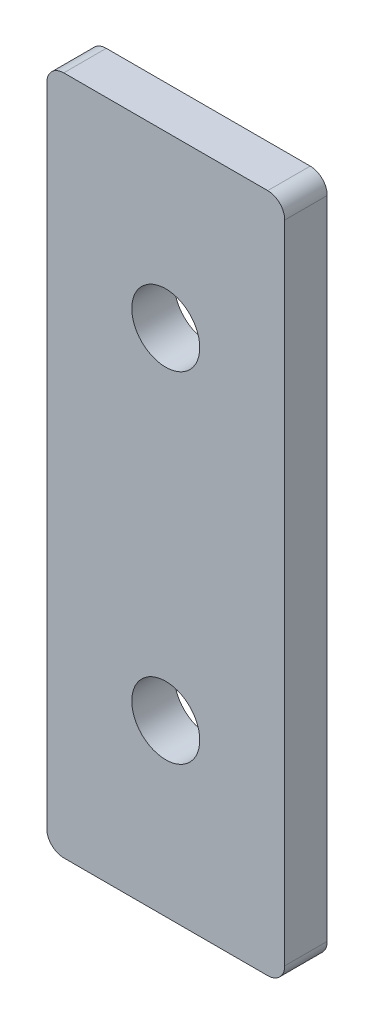
ISO-10303-21;
HEADER;
FILE_DESCRIPTION(('STEP AP214'),'2;1');
FILE_NAME('part.step','',(''),(''),'','','');
FILE_SCHEMA(('AUTOMOTIVE_DESIGN { 1 0 10303 214 1 1 1 1 }'));
ENDSEC;
DATA;
#1=APPLICATION_CONTEXT('core data for automotive mechanical design processes');
#2=APPLICATION_PROTOCOL_DEFINITION('international standard','automotive_design',2000,#1);
#3=PRODUCT_CONTEXT('',#1,'mechanical');
#4=PRODUCT('Part','Part','',(#3));
#5=PRODUCT_RELATED_PRODUCT_CATEGORY('part','',(#4));
#6=PRODUCT_DEFINITION_FORMATION('','',#4);
#7=PRODUCT_DEFINITION_CONTEXT('part definition',#1,'design');
#8=PRODUCT_DEFINITION('design','',#6,#7);
#9=PRODUCT_DEFINITION_SHAPE('','',#8);
#10=(LENGTH_UNIT() NAMED_UNIT(*) SI_UNIT(.MILLI.,.METRE.));
#11=(NAMED_UNIT(*) PLANE_ANGLE_UNIT() SI_UNIT($,.RADIAN.));
#12=(NAMED_UNIT(*) SI_UNIT($,.STERADIAN.) SOLID_ANGLE_UNIT());
#13=UNCERTAINTY_MEASURE_WITH_UNIT(LENGTH_MEASURE(1.E-05),#10,'distance_accuracy_value','');
#14=(GEOMETRIC_REPRESENTATION_CONTEXT(3) GLOBAL_UNCERTAINTY_ASSIGNED_CONTEXT((#13)) GLOBAL_UNIT_ASSIGNED_CONTEXT((#10,
#11,#12)) REPRESENTATION_CONTEXT('',''));
#15=CARTESIAN_POINT('',(0.,0.,0.));
#16=DIRECTION('',(0.,0.,1.));
#17=DIRECTION('',(1.,0.,0.));
#18=AXIS2_PLACEMENT_3D('',#15,#16,#17);
#19=CARTESIAN_POINT('',(0.,0.,2.5));
#20=DIRECTION('',(0.,0.,-1.));
#21=DIRECTION('',(-1.,0.,0.));
#22=AXIS2_PLACEMENT_3D('',#19,#20,#21);
#23=PLANE('',#22);
#24=DIRECTION('',(1.,0.,0.));
#25=VECTOR('',#24,1.);
#26=CARTESIAN_POINT('',(0.,0.,2.5));
#27=LINE('',#26,#25);
#28=CARTESIAN_POINT('',(1.,0.,2.5));
#29=VERTEX_POINT('',#28);
#30=CARTESIAN_POINT('',(13.,0.,2.5));
#31=VERTEX_POINT('',#30);
#32=EDGE_CURVE('E169',#29,#31,#27,.T.);
#33=ORIENTED_EDGE('',*,*,#32,.T.);
#34=CARTESIAN_POINT('',(13.,1.,2.5));
#35=DIRECTION('',(0.,0.,-1.));
#36=DIRECTION('',(-1.,0.,0.));
#37=AXIS2_PLACEMENT_3D('',#34,#35,#36);
#38=CIRCLE('',#37,1.);
#39=CARTESIAN_POINT('',(14.,1.,2.5));
#40=VERTEX_POINT('',#39);
#41=EDGE_CURVE('E147',#31,#40,#38,.F.);
#42=ORIENTED_EDGE('',*,*,#41,.T.);
#43=DIRECTION('',(0.,1.,0.));
#44=VECTOR('',#43,1.);
#45=CARTESIAN_POINT('',(14.,0.,2.5));
#46=LINE('',#45,#44);
#47=CARTESIAN_POINT('',(14.,39.,2.5));
#48=VERTEX_POINT('',#47);
#49=EDGE_CURVE('E117',#40,#48,#46,.T.);
#50=ORIENTED_EDGE('',*,*,#49,.T.);
#51=CARTESIAN_POINT('',(13.,39.,2.5));
#52=DIRECTION('',(0.,0.,-1.));
#53=DIRECTION('',(-1.,0.,0.));
#54=AXIS2_PLACEMENT_3D('',#51,#52,#53);
#55=CIRCLE('',#54,1.);
#56=CARTESIAN_POINT('',(13.,40.,2.5));
#57=VERTEX_POINT('',#56);
#58=EDGE_CURVE('E53',#48,#57,#55,.F.);
#59=ORIENTED_EDGE('',*,*,#58,.T.);
#60=DIRECTION('',(-1.,0.,0.));
#61=VECTOR('',#60,1.);
#62=CARTESIAN_POINT('',(0.,40.,2.5));
#63=LINE('',#62,#61);
#64=CARTESIAN_POINT('',(1.,40.,2.5));
#65=VERTEX_POINT('',#64);
#66=EDGE_CURVE('E133',#57,#65,#63,.T.);
#67=ORIENTED_EDGE('',*,*,#66,.T.);
#68=CARTESIAN_POINT('',(1.,39.,2.5));
#69=DIRECTION('',(0.,0.,-1.));
#70=DIRECTION('',(-1.,0.,0.));
#71=AXIS2_PLACEMENT_3D('',#68,#69,#70);
#72=CIRCLE('',#71,1.);
#73=CARTESIAN_POINT('',(0.,39.,2.5));
#74=VERTEX_POINT('',#73);
#75=EDGE_CURVE('E143',#65,#74,#72,.F.);
#76=ORIENTED_EDGE('',*,*,#75,.T.);
#77=DIRECTION('',(0.,-1.,0.));
#78=VECTOR('',#77,1.);
#79=CARTESIAN_POINT('',(0.,0.,2.5));
#80=LINE('',#79,#78);
#81=CARTESIAN_POINT('',(0.,1.,2.5));
#82=VERTEX_POINT('',#81);
#83=EDGE_CURVE('E127',#74,#82,#80,.T.);
#84=ORIENTED_EDGE('',*,*,#83,.T.);
#85=CARTESIAN_POINT('',(1.,1.,2.5));
#86=DIRECTION('',(0.,0.,-1.));
#87=DIRECTION('',(-1.,0.,0.));
#88=AXIS2_PLACEMENT_3D('',#85,#86,#87);
#89=CIRCLE('',#88,1.);
#90=EDGE_CURVE('E145',#82,#29,#89,.F.);
#91=ORIENTED_EDGE('',*,*,#90,.T.);
#92=EDGE_LOOP('',(#33,#42,#50,#59,#67,#76,#84,#91));
#93=FACE_BOUND('',#92,.T.);
#94=CARTESIAN_POINT('',(7.,10.,2.5));
#95=DIRECTION('',(0.,0.,1.));
#96=DIRECTION('',(1.,0.,0.));
#97=AXIS2_PLACEMENT_3D('',#94,#95,#96);
#98=CIRCLE('',#97,2.);
#99=CARTESIAN_POINT('',(9.,10.,2.5));
#100=VERTEX_POINT('',#99);
#101=EDGE_CURVE('E178',#100,#100,#98,.T.);
#102=ORIENTED_EDGE('',*,*,#101,.F.);
#103=EDGE_LOOP('',(#102));
#104=FACE_BOUND('',#103,.T.);
#105=CARTESIAN_POINT('',(7.,30.,2.5));
#106=DIRECTION('',(0.,0.,1.));
#107=DIRECTION('',(1.,0.,0.));
#108=AXIS2_PLACEMENT_3D('',#105,#106,#107);
#109=CIRCLE('',#108,2.);
#110=CARTESIAN_POINT('',(9.,30.,2.5));
#111=VERTEX_POINT('',#110);
#112=EDGE_CURVE('E183',#111,#111,#109,.T.);
#113=ORIENTED_EDGE('',*,*,#112,.F.);
#114=EDGE_LOOP('',(#113));
#115=FACE_BOUND('',#114,.T.);
#116=ADVANCED_FACE('F33',(#93,#104,#115),#23,.F.);
#117=CARTESIAN_POINT('',(0.,0.,0.));
#118=DIRECTION('',(0.,0.,-1.));
#119=DIRECTION('',(-1.,0.,0.));
#120=AXIS2_PLACEMENT_3D('',#117,#118,#119);
#121=PLANE('',#120);
#122=CARTESIAN_POINT('',(7.,10.,0.));
#123=DIRECTION('',(0.,0.,1.));
#124=DIRECTION('',(1.,0.,0.));
#125=AXIS2_PLACEMENT_3D('',#122,#123,#124);
#126=CIRCLE('',#125,2.);
#127=CARTESIAN_POINT('',(9.,10.,0.));
#128=VERTEX_POINT('',#127);
#129=EDGE_CURVE('E174',#128,#128,#126,.T.);
#130=ORIENTED_EDGE('',*,*,#129,.T.);
#131=EDGE_LOOP('',(#130));
#132=FACE_BOUND('',#131,.T.);
#133=DIRECTION('',(0.,1.,0.));
#134=VECTOR('',#133,1.);
#135=CARTESIAN_POINT('',(14.,0.,0.));
#136=LINE('',#135,#134);
#137=CARTESIAN_POINT('',(14.,1.,0.));
#138=VERTEX_POINT('',#137);
#139=CARTESIAN_POINT('',(14.,39.,0.));
#140=VERTEX_POINT('',#139);
#141=EDGE_CURVE('E115',#138,#140,#136,.T.);
#142=ORIENTED_EDGE('',*,*,#141,.F.);
#143=CARTESIAN_POINT('',(13.,1.,0.));
#144=DIRECTION('',(0.,0.,-1.));
#145=DIRECTION('',(-1.,0.,0.));
#146=AXIS2_PLACEMENT_3D('',#143,#144,#145);
#147=CIRCLE('',#146,1.);
#148=CARTESIAN_POINT('',(13.,0.,0.));
#149=VERTEX_POINT('',#148);
#150=EDGE_CURVE('E98',#138,#149,#147,.T.);
#151=ORIENTED_EDGE('',*,*,#150,.T.);
#152=DIRECTION('',(1.,0.,0.));
#153=VECTOR('',#152,1.);
#154=CARTESIAN_POINT('',(0.,0.,0.));
#155=LINE('',#154,#153);
#156=CARTESIAN_POINT('',(1.,0.,0.));
#157=VERTEX_POINT('',#156);
#158=EDGE_CURVE('E125',#157,#149,#155,.T.);
#159=ORIENTED_EDGE('',*,*,#158,.F.);
#160=CARTESIAN_POINT('',(1.,1.,0.));
#161=DIRECTION('',(0.,0.,-1.));
#162=DIRECTION('',(-1.,0.,0.));
#163=AXIS2_PLACEMENT_3D('',#160,#161,#162);
#164=CIRCLE('',#163,1.);
#165=CARTESIAN_POINT('',(0.,1.,0.));
#166=VERTEX_POINT('',#165);
#167=EDGE_CURVE('E109',#157,#166,#164,.T.);
#168=ORIENTED_EDGE('',*,*,#167,.T.);
#169=DIRECTION('',(0.,-1.,0.));
#170=VECTOR('',#169,1.);
#171=CARTESIAN_POINT('',(0.,0.,0.));
#172=LINE('',#171,#170);
#173=CARTESIAN_POINT('',(0.,39.,0.));
#174=VERTEX_POINT('',#173);
#175=EDGE_CURVE('E129',#174,#166,#172,.T.);
#176=ORIENTED_EDGE('',*,*,#175,.F.);
#177=CARTESIAN_POINT('',(1.,39.,0.));
#178=DIRECTION('',(0.,0.,-1.));
#179=DIRECTION('',(-1.,0.,0.));
#180=AXIS2_PLACEMENT_3D('',#177,#178,#179);
#181=CIRCLE('',#180,1.);
#182=CARTESIAN_POINT('',(1.,40.,0.));
#183=VERTEX_POINT('',#182);
#184=EDGE_CURVE('E136',#174,#183,#181,.T.);
#185=ORIENTED_EDGE('',*,*,#184,.T.);
#186=DIRECTION('',(-1.,0.,0.));
#187=VECTOR('',#186,1.);
#188=CARTESIAN_POINT('',(0.,40.,0.));
#189=LINE('',#188,#187);
#190=CARTESIAN_POINT('',(13.,40.,0.));
#191=VERTEX_POINT('',#190);
#192=EDGE_CURVE('E124',#191,#183,#189,.T.);
#193=ORIENTED_EDGE('',*,*,#192,.F.);
#194=CARTESIAN_POINT('',(13.,39.,0.));
#195=DIRECTION('',(0.,0.,-1.));
#196=DIRECTION('',(-1.,0.,0.));
#197=AXIS2_PLACEMENT_3D('',#194,#195,#196);
#198=CIRCLE('',#197,1.);
#199=EDGE_CURVE('E118',#191,#140,#198,.T.);
#200=ORIENTED_EDGE('',*,*,#199,.T.);
#201=EDGE_LOOP('',(#142,#151,#159,#168,#176,#185,#193,#200));
#202=FACE_BOUND('',#201,.T.);
#203=CARTESIAN_POINT('',(7.,30.,0.));
#204=DIRECTION('',(0.,0.,1.));
#205=DIRECTION('',(1.,0.,0.));
#206=AXIS2_PLACEMENT_3D('',#203,#204,#205);
#207=CIRCLE('',#206,2.);
#208=CARTESIAN_POINT('',(9.,30.,0.));
#209=VERTEX_POINT('',#208);
#210=EDGE_CURVE('E185',#209,#209,#207,.T.);
#211=ORIENTED_EDGE('',*,*,#210,.T.);
#212=EDGE_LOOP('',(#211));
#213=FACE_BOUND('',#212,.T.);
#214=ADVANCED_FACE('F121',(#132,#202,#213),#121,.T.);
#215=CARTESIAN_POINT('',(0.,0.,2.5));
#216=DIRECTION('',(1.,0.,0.));
#217=DIRECTION('',(0.,0.,-1.));
#218=AXIS2_PLACEMENT_3D('',#215,#216,#217);
#219=PLANE('',#218);
#220=ORIENTED_EDGE('',*,*,#175,.T.);
#221=DIRECTION('',(0.,0.,-1.));
#222=VECTOR('',#221,1.);
#223=CARTESIAN_POINT('',(0.,1.,2.5));
#224=LINE('',#223,#222);
#225=EDGE_CURVE('E152',#166,#82,#224,.F.);
#226=ORIENTED_EDGE('',*,*,#225,.T.);
#227=ORIENTED_EDGE('',*,*,#83,.F.);
#228=DIRECTION('',(0.,0.,-1.));
#229=VECTOR('',#228,1.);
#230=CARTESIAN_POINT('',(0.,39.,2.5));
#231=LINE('',#230,#229);
#232=EDGE_CURVE('E149',#74,#174,#231,.T.);
#233=ORIENTED_EDGE('',*,*,#232,.T.);
#234=EDGE_LOOP('',(#220,#226,#227,#233));
#235=FACE_BOUND('',#234,.T.);
#236=ADVANCED_FACE('F165',(#235),#219,.F.);
#237=CARTESIAN_POINT('',(0.,0.,2.5));
#238=DIRECTION('',(0.,1.,0.));
#239=DIRECTION('',(0.,0.,1.));
#240=AXIS2_PLACEMENT_3D('',#237,#238,#239);
#241=PLANE('',#240);
#242=ORIENTED_EDGE('',*,*,#158,.T.);
#243=DIRECTION('',(0.,0.,-1.));
#244=VECTOR('',#243,1.);
#245=CARTESIAN_POINT('',(13.,0.,2.5));
#246=LINE('',#245,#244);
#247=EDGE_CURVE('E103',#149,#31,#246,.F.);
#248=ORIENTED_EDGE('',*,*,#247,.T.);
#249=ORIENTED_EDGE('',*,*,#32,.F.);
#250=DIRECTION('',(0.,0.,-1.));
#251=VECTOR('',#250,1.);
#252=CARTESIAN_POINT('',(1.,0.,2.5));
#253=LINE('',#252,#251);
#254=EDGE_CURVE('E108',#29,#157,#253,.T.);
#255=ORIENTED_EDGE('',*,*,#254,.T.);
#256=EDGE_LOOP('',(#242,#248,#249,#255));
#257=FACE_BOUND('',#256,.T.);
#258=ADVANCED_FACE('F210',(#257),#241,.F.);
#259=CARTESIAN_POINT('',(14.,0.,2.5));
#260=DIRECTION('',(-1.,0.,0.));
#261=DIRECTION('',(0.,0.,1.));
#262=AXIS2_PLACEMENT_3D('',#259,#260,#261);
#263=PLANE('',#262);
#264=ORIENTED_EDGE('',*,*,#49,.F.);
#265=DIRECTION('',(0.,0.,-1.));
#266=VECTOR('',#265,1.);
#267=CARTESIAN_POINT('',(14.,1.,2.5));
#268=LINE('',#267,#266);
#269=EDGE_CURVE('E102',#40,#138,#268,.T.);
#270=ORIENTED_EDGE('',*,*,#269,.T.);
#271=ORIENTED_EDGE('',*,*,#141,.T.);
#272=DIRECTION('',(0.,0.,-1.));
#273=VECTOR('',#272,1.);
#274=CARTESIAN_POINT('',(14.,39.,2.5));
#275=LINE('',#274,#273);
#276=EDGE_CURVE('E119',#140,#48,#275,.F.);
#277=ORIENTED_EDGE('',*,*,#276,.T.);
#278=EDGE_LOOP('',(#264,#270,#271,#277));
#279=FACE_BOUND('',#278,.T.);
#280=ADVANCED_FACE('F114',(#279),#263,.F.);
#281=CARTESIAN_POINT('',(0.,40.,2.5));
#282=DIRECTION('',(0.,-1.,0.));
#283=DIRECTION('',(0.,0.,-1.));
#284=AXIS2_PLACEMENT_3D('',#281,#282,#283);
#285=PLANE('',#284);
#286=ORIENTED_EDGE('',*,*,#192,.T.);
#287=DIRECTION('',(0.,0.,-1.));
#288=VECTOR('',#287,1.);
#289=CARTESIAN_POINT('',(1.,40.,2.5));
#290=LINE('',#289,#288);
#291=EDGE_CURVE('E11',#183,#65,#290,.F.);
#292=ORIENTED_EDGE('',*,*,#291,.T.);
#293=ORIENTED_EDGE('',*,*,#66,.F.);
#294=DIRECTION('',(0.,0.,-1.));
#295=VECTOR('',#294,1.);
#296=CARTESIAN_POINT('',(13.,40.,2.5));
#297=LINE('',#296,#295);
#298=EDGE_CURVE('E41',#57,#191,#297,.T.);
#299=ORIENTED_EDGE('',*,*,#298,.T.);
#300=EDGE_LOOP('',(#286,#292,#293,#299));
#301=FACE_BOUND('',#300,.T.);
#302=ADVANCED_FACE('F155',(#301),#285,.F.);
#303=CARTESIAN_POINT('',(7.,10.,2.5));
#304=DIRECTION('',(0.,0.,-1.));
#305=DIRECTION('',(-1.,0.,0.));
#306=AXIS2_PLACEMENT_3D('',#303,#304,#305);
#307=CYLINDRICAL_SURFACE('',#306,2.);
#308=ORIENTED_EDGE('',*,*,#101,.T.);
#309=EDGE_LOOP('',(#308));
#310=FACE_BOUND('',#309,.T.);
#311=ORIENTED_EDGE('',*,*,#129,.F.);
#312=EDGE_LOOP('',(#311));
#313=FACE_BOUND('',#312,.T.);
#314=ADVANCED_FACE('F203',(#310,#313),#307,.F.);
#315=CARTESIAN_POINT('',(7.,30.,2.5));
#316=DIRECTION('',(0.,0.,-1.));
#317=DIRECTION('',(-1.,0.,0.));
#318=AXIS2_PLACEMENT_3D('',#315,#316,#317);
#319=CYLINDRICAL_SURFACE('',#318,2.);
#320=ORIENTED_EDGE('',*,*,#112,.T.);
#321=EDGE_LOOP('',(#320));
#322=FACE_BOUND('',#321,.T.);
#323=ORIENTED_EDGE('',*,*,#210,.F.);
#324=EDGE_LOOP('',(#323));
#325=FACE_BOUND('',#324,.T.);
#326=ADVANCED_FACE('F191',(#322,#325),#319,.F.);
#327=CARTESIAN_POINT('',(13.,1.,2.5));
#328=DIRECTION('',(0.,0.,-1.));
#329=DIRECTION('',(-1.,0.,0.));
#330=AXIS2_PLACEMENT_3D('',#327,#328,#329);
#331=CYLINDRICAL_SURFACE('',#330,1.);
#332=ORIENTED_EDGE('',*,*,#41,.F.);
#333=ORIENTED_EDGE('',*,*,#247,.F.);
#334=ORIENTED_EDGE('',*,*,#150,.F.);
#335=ORIENTED_EDGE('',*,*,#269,.F.);
#336=EDGE_LOOP('',(#332,#333,#334,#335));
#337=FACE_BOUND('',#336,.T.);
#338=ADVANCED_FACE('F101',(#337),#331,.T.);
#339=CARTESIAN_POINT('',(1.,1.,2.5));
#340=DIRECTION('',(0.,0.,-1.));
#341=DIRECTION('',(-1.,0.,0.));
#342=AXIS2_PLACEMENT_3D('',#339,#340,#341);
#343=CYLINDRICAL_SURFACE('',#342,1.);
#344=ORIENTED_EDGE('',*,*,#90,.F.);
#345=ORIENTED_EDGE('',*,*,#225,.F.);
#346=ORIENTED_EDGE('',*,*,#167,.F.);
#347=ORIENTED_EDGE('',*,*,#254,.F.);
#348=EDGE_LOOP('',(#344,#345,#346,#347));
#349=FACE_BOUND('',#348,.T.);
#350=ADVANCED_FACE('F218',(#349),#343,.T.);
#351=CARTESIAN_POINT('',(1.,39.,2.5));
#352=DIRECTION('',(0.,0.,-1.));
#353=DIRECTION('',(-1.,0.,0.));
#354=AXIS2_PLACEMENT_3D('',#351,#352,#353);
#355=CYLINDRICAL_SURFACE('',#354,1.);
#356=ORIENTED_EDGE('',*,*,#75,.F.);
#357=ORIENTED_EDGE('',*,*,#291,.F.);
#358=ORIENTED_EDGE('',*,*,#184,.F.);
#359=ORIENTED_EDGE('',*,*,#232,.F.);
#360=EDGE_LOOP('',(#356,#357,#358,#359));
#361=FACE_BOUND('',#360,.T.);
#362=ADVANCED_FACE('F162',(#361),#355,.T.);
#363=CARTESIAN_POINT('',(13.,39.,2.5));
#364=DIRECTION('',(0.,0.,-1.));
#365=DIRECTION('',(-1.,0.,0.));
#366=AXIS2_PLACEMENT_3D('',#363,#364,#365);
#367=CYLINDRICAL_SURFACE('',#366,1.);
#368=ORIENTED_EDGE('',*,*,#58,.F.);
#369=ORIENTED_EDGE('',*,*,#276,.F.);
#370=ORIENTED_EDGE('',*,*,#199,.F.);
#371=ORIENTED_EDGE('',*,*,#298,.F.);
#372=EDGE_LOOP('',(#368,#369,#370,#371));
#373=FACE_BOUND('',#372,.T.);
#374=ADVANCED_FACE('F35',(#373),#367,.T.);
#375=CLOSED_SHELL('',(#116,#214,#236,#258,#280,#302,#314,#326,#338,#350,#362,#374));
#376=MANIFOLD_SOLID_BREP('B2',#375);
#377=ADVANCED_BREP_SHAPE_REPRESENTATION('',(#18,#376),#14);
#378=SHAPE_DEFINITION_REPRESENTATION(#9,#377);
ENDSEC;
END-ISO-10303-21;
